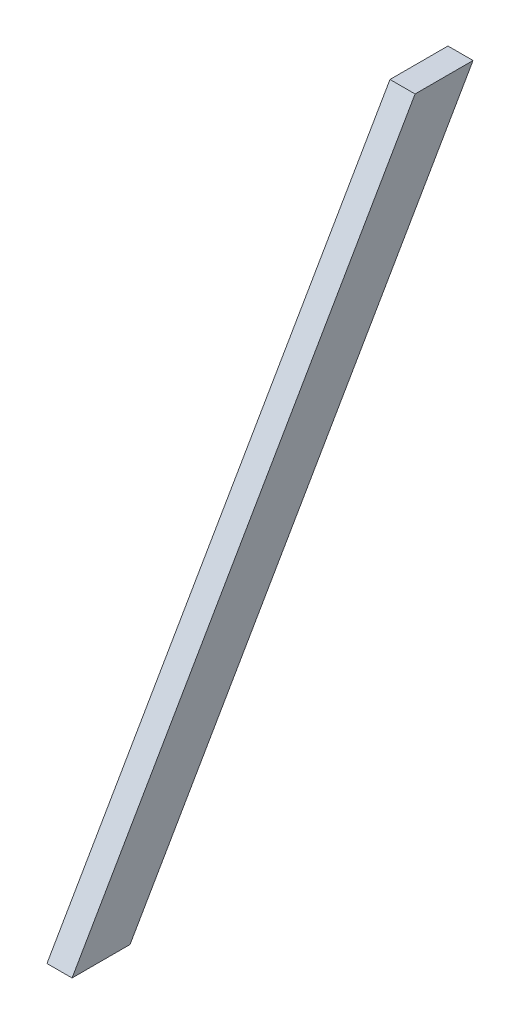
ISO-10303-21;
HEADER;
FILE_DESCRIPTION(('STEP AP214'),'2;1');
FILE_NAME('part.step','',(''),(''),'','','');
FILE_SCHEMA(('AUTOMOTIVE_DESIGN { 1 0 10303 214 1 1 1 1 }'));
ENDSEC;
DATA;
#1=APPLICATION_CONTEXT('core data for automotive mechanical design processes');
#2=APPLICATION_PROTOCOL_DEFINITION('international standard','automotive_design',2000,#1);
#3=PRODUCT_CONTEXT('',#1,'mechanical');
#4=PRODUCT('Part','Part','',(#3));
#5=PRODUCT_RELATED_PRODUCT_CATEGORY('part','',(#4));
#6=PRODUCT_DEFINITION_FORMATION('','',#4);
#7=PRODUCT_DEFINITION_CONTEXT('part definition',#1,'design');
#8=PRODUCT_DEFINITION('design','',#6,#7);
#9=PRODUCT_DEFINITION_SHAPE('','',#8);
#10=(LENGTH_UNIT() NAMED_UNIT(*) SI_UNIT(.MILLI.,.METRE.));
#11=(NAMED_UNIT(*) PLANE_ANGLE_UNIT() SI_UNIT($,.RADIAN.));
#12=(NAMED_UNIT(*) SI_UNIT($,.STERADIAN.) SOLID_ANGLE_UNIT());
#13=UNCERTAINTY_MEASURE_WITH_UNIT(LENGTH_MEASURE(1.E-05),#10,'distance_accuracy_value','');
#14=(GEOMETRIC_REPRESENTATION_CONTEXT(3) GLOBAL_UNCERTAINTY_ASSIGNED_CONTEXT((#13)) GLOBAL_UNIT_ASSIGNED_CONTEXT((#10,
#11,#12)) REPRESENTATION_CONTEXT('',''));
#15=CARTESIAN_POINT('',(0.,0.,0.));
#16=DIRECTION('',(0.,0.,1.));
#17=DIRECTION('',(1.,0.,0.));
#18=AXIS2_PLACEMENT_3D('',#15,#16,#17);
#19=CARTESIAN_POINT('',(609.6,0.,0.));
#20=DIRECTION('',(1.,0.,0.));
#21=DIRECTION('',(0.,0.,-1.));
#22=AXIS2_PLACEMENT_3D('',#19,#20,#21);
#23=PLANE('',#22);
#24=DIRECTION('',(0.,-0.866025403784429,0.500000000000017));
#25=VECTOR('',#24,1.);
#26=CARTESIAN_POINT('',(609.6,57.15,267.630717282834));
#27=LINE('',#26,#25);
#28=CARTESIAN_POINT('',(609.6,57.15,267.630717282834));
#29=VERTEX_POINT('',#28);
#30=CARTESIAN_POINT('',(609.6,507.999999999997,7.33234841870264));
#31=VERTEX_POINT('',#30);
#32=EDGE_CURVE('E67',#29,#31,#27,.F.);
#33=ORIENTED_EDGE('',*,*,#32,.T.);
#34=DIRECTION('',(0.,0.,-1.));
#35=VECTOR('',#34,1.);
#36=CARTESIAN_POINT('',(609.6,508.,7.33234841870792));
#37=LINE('',#36,#35);
#38=CARTESIAN_POINT('',(609.6,508.,51.3264389309656));
#39=VERTEX_POINT('',#38);
#40=EDGE_CURVE('E19',#31,#39,#37,.F.);
#41=ORIENTED_EDGE('',*,*,#40,.T.);
#42=DIRECTION('',(0.,0.866025403784429,-0.500000000000017));
#43=VECTOR('',#42,1.);
#44=CARTESIAN_POINT('',(609.6,508.,51.3264389309656));
#45=LINE('',#44,#43);
#46=CARTESIAN_POINT('',(609.6,57.1500000000008,311.624807795114));
#47=VERTEX_POINT('',#46);
#48=EDGE_CURVE('E57',#39,#47,#45,.F.);
#49=ORIENTED_EDGE('',*,*,#48,.T.);
#50=DIRECTION('',(0.,0.,1.));
#51=VECTOR('',#50,1.);
#52=CARTESIAN_POINT('',(609.6,57.15,311.624807795112));
#53=LINE('',#52,#51);
#54=EDGE_CURVE('E52',#47,#29,#53,.F.);
#55=ORIENTED_EDGE('',*,*,#54,.T.);
#56=EDGE_LOOP('',(#33,#41,#49,#55));
#57=FACE_BOUND('',#56,.T.);
#58=ADVANCED_FACE('F16',(#57),#23,.T.);
#59=CARTESIAN_POINT('',(609.6,508.,7.33234841870792));
#60=DIRECTION('',(0.,-1.,0.));
#61=DIRECTION('',(0.,0.,-1.));
#62=AXIS2_PLACEMENT_3D('',#59,#60,#61);
#63=PLANE('',#62);
#64=DIRECTION('',(0.,0.,-1.));
#65=VECTOR('',#64,1.);
#66=CARTESIAN_POINT('',(590.55,508.,0.));
#67=LINE('',#66,#65);
#68=CARTESIAN_POINT('',(590.55,507.999999999997,7.3323484187026));
#69=VERTEX_POINT('',#68);
#70=CARTESIAN_POINT('',(590.55,508.,51.3264389309656));
#71=VERTEX_POINT('',#70);
#72=EDGE_CURVE('E73',#69,#71,#67,.F.);
#73=ORIENTED_EDGE('',*,*,#72,.T.);
#74=DIRECTION('',(1.,0.,0.));
#75=VECTOR('',#74,1.);
#76=CARTESIAN_POINT('',(609.6,508.,51.3264389309656));
#77=LINE('',#76,#75);
#78=EDGE_CURVE('E62',#71,#39,#77,.T.);
#79=ORIENTED_EDGE('',*,*,#78,.T.);
#80=ORIENTED_EDGE('',*,*,#40,.F.);
#81=DIRECTION('',(1.,0.,0.));
#82=VECTOR('',#81,1.);
#83=CARTESIAN_POINT('',(609.6,507.999999999988,7.33234841868668));
#84=LINE('',#83,#82);
#85=EDGE_CURVE('E79',#31,#69,#84,.F.);
#86=ORIENTED_EDGE('',*,*,#85,.T.);
#87=EDGE_LOOP('',(#73,#79,#80,#86));
#88=FACE_BOUND('',#87,.T.);
#89=ADVANCED_FACE('F72',(#88),#63,.F.);
#90=CARTESIAN_POINT('',(609.6,508.,51.3264389309656));
#91=DIRECTION('',(0.,-0.500000000000017,-0.866025403784429));
#92=DIRECTION('',(0.,0.866025403784429,-0.500000000000017));
#93=AXIS2_PLACEMENT_3D('',#90,#91,#92);
#94=PLANE('',#93);
#95=DIRECTION('',(0.,-0.866025403784436,0.500000000000005));
#96=VECTOR('',#95,1.);
#97=CARTESIAN_POINT('',(590.55,508.,51.3264389309656));
#98=LINE('',#97,#96);
#99=CARTESIAN_POINT('',(590.55,57.1500000000017,311.624807795115));
#100=VERTEX_POINT('',#99);
#101=EDGE_CURVE('E83',#71,#100,#98,.T.);
#102=ORIENTED_EDGE('',*,*,#101,.T.);
#103=DIRECTION('',(1.,0.,0.));
#104=VECTOR('',#103,1.);
#105=CARTESIAN_POINT('',(609.6,57.15,311.624807795112));
#106=LINE('',#105,#104);
#107=EDGE_CURVE('E64',#100,#47,#106,.T.);
#108=ORIENTED_EDGE('',*,*,#107,.T.);
#109=ORIENTED_EDGE('',*,*,#48,.F.);
#110=ORIENTED_EDGE('',*,*,#78,.F.);
#111=EDGE_LOOP('',(#102,#108,#109,#110));
#112=FACE_BOUND('',#111,.T.);
#113=ADVANCED_FACE('F60',(#112),#94,.F.);
#114=CARTESIAN_POINT('',(609.6,57.15,311.624807795112));
#115=DIRECTION('',(0.,1.,0.));
#116=DIRECTION('',(0.,0.,1.));
#117=AXIS2_PLACEMENT_3D('',#114,#115,#116);
#118=PLANE('',#117);
#119=DIRECTION('',(0.,0.,-1.));
#120=VECTOR('',#119,1.);
#121=CARTESIAN_POINT('',(590.55,57.15,0.));
#122=LINE('',#121,#120);
#123=CARTESIAN_POINT('',(590.55,57.15,267.630717282834));
#124=VERTEX_POINT('',#123);
#125=EDGE_CURVE('E25',#100,#124,#122,.T.);
#126=ORIENTED_EDGE('',*,*,#125,.T.);
#127=DIRECTION('',(1.,0.,0.));
#128=VECTOR('',#127,1.);
#129=CARTESIAN_POINT('',(609.6,57.15,267.630717282834));
#130=LINE('',#129,#128);
#131=EDGE_CURVE('E33',#124,#29,#130,.T.);
#132=ORIENTED_EDGE('',*,*,#131,.T.);
#133=ORIENTED_EDGE('',*,*,#54,.F.);
#134=ORIENTED_EDGE('',*,*,#107,.F.);
#135=EDGE_LOOP('',(#126,#132,#133,#134));
#136=FACE_BOUND('',#135,.T.);
#137=ADVANCED_FACE('F87',(#136),#118,.F.);
#138=CARTESIAN_POINT('',(609.6,57.15,267.630717282834));
#139=DIRECTION('',(0.,0.500000000000017,0.866025403784429));
#140=DIRECTION('',(0.,-0.866025403784429,0.500000000000017));
#141=AXIS2_PLACEMENT_3D('',#138,#139,#140);
#142=PLANE('',#141);
#143=DIRECTION('',(0.,0.866025403784453,-0.499999999999976));
#144=VECTOR('',#143,1.);
#145=CARTESIAN_POINT('',(590.55,57.15,267.630717282834));
#146=LINE('',#145,#144);
#147=EDGE_CURVE('E11',#124,#69,#146,.T.);
#148=ORIENTED_EDGE('',*,*,#147,.T.);
#149=ORIENTED_EDGE('',*,*,#85,.F.);
#150=ORIENTED_EDGE('',*,*,#32,.F.);
#151=ORIENTED_EDGE('',*,*,#131,.F.);
#152=EDGE_LOOP('',(#148,#149,#150,#151));
#153=FACE_BOUND('',#152,.T.);
#154=ADVANCED_FACE('F90',(#153),#142,.F.);
#155=CARTESIAN_POINT('',(590.55,0.,0.));
#156=DIRECTION('',(1.,0.,0.));
#157=DIRECTION('',(0.,0.,-1.));
#158=AXIS2_PLACEMENT_3D('',#155,#156,#157);
#159=PLANE('',#158);
#160=ORIENTED_EDGE('',*,*,#125,.F.);
#161=ORIENTED_EDGE('',*,*,#101,.F.);
#162=ORIENTED_EDGE('',*,*,#72,.F.);
#163=ORIENTED_EDGE('',*,*,#147,.F.);
#164=EDGE_LOOP('',(#160,#161,#162,#163));
#165=FACE_BOUND('',#164,.T.);
#166=ADVANCED_FACE('F89',(#165),#159,.F.);
#167=CLOSED_SHELL('',(#58,#89,#113,#137,#154,#166));
#168=MANIFOLD_SOLID_BREP('B1',#167);
#169=ADVANCED_BREP_SHAPE_REPRESENTATION('',(#18,#168),#14);
#170=SHAPE_DEFINITION_REPRESENTATION(#9,#169);
ENDSEC;
END-ISO-10303-21;
